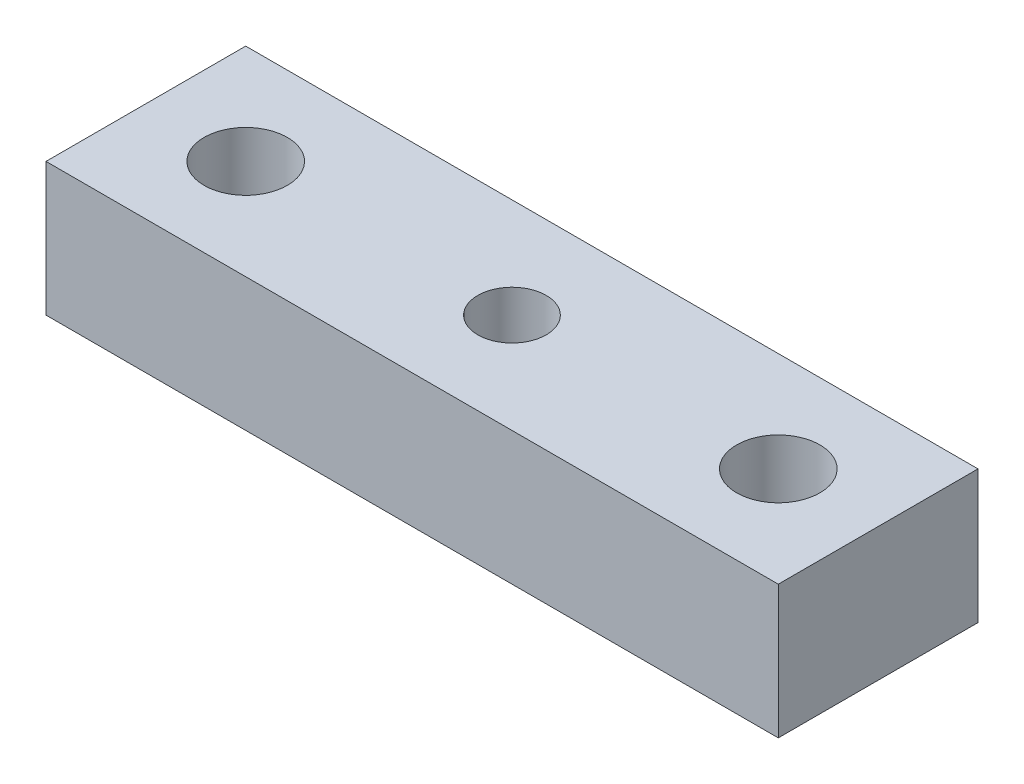
ISO-10303-21;
HEADER;
FILE_DESCRIPTION(('STEP AP214'),'2;1');
FILE_NAME('part.step','',(''),(''),'','','');
FILE_SCHEMA(('AUTOMOTIVE_DESIGN { 1 0 10303 214 1 1 1 1 }'));
ENDSEC;
DATA;
#1=APPLICATION_CONTEXT('core data for automotive mechanical design processes');
#2=APPLICATION_PROTOCOL_DEFINITION('international standard','automotive_design',2000,#1);
#3=PRODUCT_CONTEXT('',#1,'mechanical');
#4=PRODUCT('Part','Part','',(#3));
#5=PRODUCT_RELATED_PRODUCT_CATEGORY('part','',(#4));
#6=PRODUCT_DEFINITION_FORMATION('','',#4);
#7=PRODUCT_DEFINITION_CONTEXT('part definition',#1,'design');
#8=PRODUCT_DEFINITION('design','',#6,#7);
#9=PRODUCT_DEFINITION_SHAPE('','',#8);
#10=(LENGTH_UNIT() NAMED_UNIT(*) SI_UNIT(.MILLI.,.METRE.));
#11=(NAMED_UNIT(*) PLANE_ANGLE_UNIT() SI_UNIT($,.RADIAN.));
#12=(NAMED_UNIT(*) SI_UNIT($,.STERADIAN.) SOLID_ANGLE_UNIT());
#13=UNCERTAINTY_MEASURE_WITH_UNIT(LENGTH_MEASURE(1.E-05),#10,'distance_accuracy_value','');
#14=(GEOMETRIC_REPRESENTATION_CONTEXT(3) GLOBAL_UNCERTAINTY_ASSIGNED_CONTEXT((#13)) GLOBAL_UNIT_ASSIGNED_CONTEXT((#10,
#11,#12)) REPRESENTATION_CONTEXT('',''));
#15=CARTESIAN_POINT('',(0.,0.,0.));
#16=DIRECTION('',(0.,0.,1.));
#17=DIRECTION('',(1.,0.,0.));
#18=AXIS2_PLACEMENT_3D('',#15,#16,#17);
#19=CARTESIAN_POINT('',(34.925,-6.35,19.05));
#20=DIRECTION('',(-1.,0.,0.));
#21=DIRECTION('',(0.,0.,1.));
#22=AXIS2_PLACEMENT_3D('',#19,#20,#21);
#23=PLANE('',#22);
#24=DIRECTION('',(0.,1.,0.));
#25=VECTOR('',#24,1.);
#26=CARTESIAN_POINT('',(34.925,-6.35,0.));
#27=LINE('',#26,#25);
#28=CARTESIAN_POINT('',(34.925,-6.35,0.));
#29=VERTEX_POINT('',#28);
#30=CARTESIAN_POINT('',(34.925,6.35,0.));
#31=VERTEX_POINT('',#30);
#32=EDGE_CURVE('E100',#29,#31,#27,.T.);
#33=ORIENTED_EDGE('',*,*,#32,.T.);
#34=DIRECTION('',(0.,0.,-1.));
#35=VECTOR('',#34,1.);
#36=CARTESIAN_POINT('',(34.925,6.35,19.05));
#37=LINE('',#36,#35);
#38=CARTESIAN_POINT('',(34.925,6.35,19.05));
#39=VERTEX_POINT('',#38);
#40=EDGE_CURVE('E11',#39,#31,#37,.T.);
#41=ORIENTED_EDGE('',*,*,#40,.F.);
#42=DIRECTION('',(0.,1.,0.));
#43=VECTOR('',#42,1.);
#44=CARTESIAN_POINT('',(34.925,-6.35,19.05));
#45=LINE('',#44,#43);
#46=CARTESIAN_POINT('',(34.925,-6.35,19.05));
#47=VERTEX_POINT('',#46);
#48=EDGE_CURVE('E88',#47,#39,#45,.T.);
#49=ORIENTED_EDGE('',*,*,#48,.F.);
#50=DIRECTION('',(0.,0.,-1.));
#51=VECTOR('',#50,1.);
#52=CARTESIAN_POINT('',(34.925,-6.35,19.05));
#53=LINE('',#52,#51);
#54=EDGE_CURVE('E96',#47,#29,#53,.T.);
#55=ORIENTED_EDGE('',*,*,#54,.T.);
#56=EDGE_LOOP('',(#33,#41,#49,#55));
#57=FACE_BOUND('',#56,.T.);
#58=ADVANCED_FACE('F37',(#57),#23,.F.);
#59=CARTESIAN_POINT('',(-34.925,6.35,19.05));
#60=DIRECTION('',(0.,-1.,0.));
#61=DIRECTION('',(0.,0.,-1.));
#62=AXIS2_PLACEMENT_3D('',#59,#60,#61);
#63=PLANE('',#62);
#64=CARTESIAN_POINT('',(0.,6.35,9.525));
#65=DIRECTION('',(0.,1.,0.));
#66=DIRECTION('',(0.,0.,1.));
#67=AXIS2_PLACEMENT_3D('',#64,#65,#66);
#68=CIRCLE('',#67,3.26389999999999);
#69=CARTESIAN_POINT('',(0.,6.35,12.7889));
#70=VERTEX_POINT('',#69);
#71=EDGE_CURVE('E128',#70,#70,#68,.T.);
#72=ORIENTED_EDGE('',*,*,#71,.F.);
#73=EDGE_LOOP('',(#72));
#74=FACE_BOUND('',#73,.T.);
#75=CARTESIAN_POINT('',(-25.4,6.35,9.525));
#76=DIRECTION('',(0.,1.,0.));
#77=DIRECTION('',(0.,0.,1.));
#78=AXIS2_PLACEMENT_3D('',#75,#76,#77);
#79=CIRCLE('',#78,3.96875);
#80=CARTESIAN_POINT('',(-25.4,6.35,13.49375));
#81=VERTEX_POINT('',#80);
#82=EDGE_CURVE('E122',#81,#81,#79,.T.);
#83=ORIENTED_EDGE('',*,*,#82,.F.);
#84=EDGE_LOOP('',(#83));
#85=FACE_BOUND('',#84,.T.);
#86=CARTESIAN_POINT('',(25.4,6.35,9.525));
#87=DIRECTION('',(0.,1.,0.));
#88=DIRECTION('',(0.,0.,1.));
#89=AXIS2_PLACEMENT_3D('',#86,#87,#88);
#90=CIRCLE('',#89,3.96875);
#91=CARTESIAN_POINT('',(25.4,6.35,13.49375));
#92=VERTEX_POINT('',#91);
#93=EDGE_CURVE('E116',#92,#92,#90,.T.);
#94=ORIENTED_EDGE('',*,*,#93,.F.);
#95=EDGE_LOOP('',(#94));
#96=FACE_BOUND('',#95,.T.);
#97=DIRECTION('',(-1.,0.,0.));
#98=VECTOR('',#97,1.);
#99=CARTESIAN_POINT('',(-34.925,6.35,0.));
#100=LINE('',#99,#98);
#101=CARTESIAN_POINT('',(-34.925,6.35,0.));
#102=VERTEX_POINT('',#101);
#103=EDGE_CURVE('E92',#31,#102,#100,.T.);
#104=ORIENTED_EDGE('',*,*,#103,.T.);
#105=DIRECTION('',(0.,0.,-1.));
#106=VECTOR('',#105,1.);
#107=CARTESIAN_POINT('',(-34.925,6.35,19.05));
#108=LINE('',#107,#106);
#109=CARTESIAN_POINT('',(-34.925,6.35,19.05));
#110=VERTEX_POINT('',#109);
#111=EDGE_CURVE('E45',#110,#102,#108,.T.);
#112=ORIENTED_EDGE('',*,*,#111,.F.);
#113=DIRECTION('',(-1.,0.,0.));
#114=VECTOR('',#113,1.);
#115=CARTESIAN_POINT('',(-34.925,6.35,19.05));
#116=LINE('',#115,#114);
#117=EDGE_CURVE('E83',#39,#110,#116,.T.);
#118=ORIENTED_EDGE('',*,*,#117,.F.);
#119=ORIENTED_EDGE('',*,*,#40,.T.);
#120=EDGE_LOOP('',(#104,#112,#118,#119));
#121=FACE_BOUND('',#120,.T.);
#122=ADVANCED_FACE('F91',(#74,#85,#96,#121),#63,.F.);
#123=CARTESIAN_POINT('',(-34.925,-6.35,19.05));
#124=DIRECTION('',(1.,0.,0.));
#125=DIRECTION('',(0.,0.,-1.));
#126=AXIS2_PLACEMENT_3D('',#123,#124,#125);
#127=PLANE('',#126);
#128=DIRECTION('',(0.,-1.,0.));
#129=VECTOR('',#128,1.);
#130=CARTESIAN_POINT('',(-34.925,-6.35,0.));
#131=LINE('',#130,#129);
#132=CARTESIAN_POINT('',(-34.925,-6.35,0.));
#133=VERTEX_POINT('',#132);
#134=EDGE_CURVE('E70',#102,#133,#131,.T.);
#135=ORIENTED_EDGE('',*,*,#134,.T.);
#136=DIRECTION('',(0.,0.,-1.));
#137=VECTOR('',#136,1.);
#138=CARTESIAN_POINT('',(-34.925,-6.35,19.05));
#139=LINE('',#138,#137);
#140=CARTESIAN_POINT('',(-34.925,-6.35,19.05));
#141=VERTEX_POINT('',#140);
#142=EDGE_CURVE('E93',#141,#133,#139,.T.);
#143=ORIENTED_EDGE('',*,*,#142,.F.);
#144=DIRECTION('',(0.,-1.,0.));
#145=VECTOR('',#144,1.);
#146=CARTESIAN_POINT('',(-34.925,-6.35,19.05));
#147=LINE('',#146,#145);
#148=EDGE_CURVE('E86',#110,#141,#147,.T.);
#149=ORIENTED_EDGE('',*,*,#148,.F.);
#150=ORIENTED_EDGE('',*,*,#111,.T.);
#151=EDGE_LOOP('',(#135,#143,#149,#150));
#152=FACE_BOUND('',#151,.T.);
#153=ADVANCED_FACE('F94',(#152),#127,.F.);
#154=CARTESIAN_POINT('',(-34.925,-6.35,19.05));
#155=DIRECTION('',(0.,1.,0.));
#156=DIRECTION('',(0.,0.,1.));
#157=AXIS2_PLACEMENT_3D('',#154,#155,#156);
#158=PLANE('',#157);
#159=CARTESIAN_POINT('',(0.,-6.35,9.525));
#160=DIRECTION('',(0.,1.,0.));
#161=DIRECTION('',(0.,0.,1.));
#162=AXIS2_PLACEMENT_3D('',#159,#160,#161);
#163=CIRCLE('',#162,3.2639);
#164=CARTESIAN_POINT('',(0.,-6.35,12.7889));
#165=VERTEX_POINT('',#164);
#166=EDGE_CURVE('E125',#165,#165,#163,.T.);
#167=ORIENTED_EDGE('',*,*,#166,.T.);
#168=EDGE_LOOP('',(#167));
#169=FACE_BOUND('',#168,.T.);
#170=CARTESIAN_POINT('',(-25.4,-6.35,9.525));
#171=DIRECTION('',(0.,1.,0.));
#172=DIRECTION('',(0.,0.,1.));
#173=AXIS2_PLACEMENT_3D('',#170,#171,#172);
#174=CIRCLE('',#173,3.96875);
#175=CARTESIAN_POINT('',(-25.4,-6.35,13.49375));
#176=VERTEX_POINT('',#175);
#177=EDGE_CURVE('E119',#176,#176,#174,.T.);
#178=ORIENTED_EDGE('',*,*,#177,.T.);
#179=EDGE_LOOP('',(#178));
#180=FACE_BOUND('',#179,.T.);
#181=CARTESIAN_POINT('',(25.4,-6.35,9.525));
#182=DIRECTION('',(0.,1.,0.));
#183=DIRECTION('',(0.,0.,1.));
#184=AXIS2_PLACEMENT_3D('',#181,#182,#183);
#185=CIRCLE('',#184,3.96875);
#186=CARTESIAN_POINT('',(25.4,-6.35,13.49375));
#187=VERTEX_POINT('',#186);
#188=EDGE_CURVE('E103',#187,#187,#185,.T.);
#189=ORIENTED_EDGE('',*,*,#188,.T.);
#190=EDGE_LOOP('',(#189));
#191=FACE_BOUND('',#190,.T.);
#192=DIRECTION('',(1.,0.,0.));
#193=VECTOR('',#192,1.);
#194=CARTESIAN_POINT('',(-34.925,-6.35,0.));
#195=LINE('',#194,#193);
#196=EDGE_CURVE('E76',#133,#29,#195,.T.);
#197=ORIENTED_EDGE('',*,*,#196,.T.);
#198=ORIENTED_EDGE('',*,*,#54,.F.);
#199=DIRECTION('',(1.,0.,0.));
#200=VECTOR('',#199,1.);
#201=CARTESIAN_POINT('',(-34.925,-6.35,19.05));
#202=LINE('',#201,#200);
#203=EDGE_CURVE('E53',#141,#47,#202,.T.);
#204=ORIENTED_EDGE('',*,*,#203,.F.);
#205=ORIENTED_EDGE('',*,*,#142,.T.);
#206=EDGE_LOOP('',(#197,#198,#204,#205));
#207=FACE_BOUND('',#206,.T.);
#208=ADVANCED_FACE('F108',(#169,#180,#191,#207),#158,.F.);
#209=CARTESIAN_POINT('',(0.,0.,19.05));
#210=DIRECTION('',(0.,0.,-1.));
#211=DIRECTION('',(-1.,0.,0.));
#212=AXIS2_PLACEMENT_3D('',#209,#210,#211);
#213=PLANE('',#212);
#214=ORIENTED_EDGE('',*,*,#48,.T.);
#215=ORIENTED_EDGE('',*,*,#117,.T.);
#216=ORIENTED_EDGE('',*,*,#148,.T.);
#217=ORIENTED_EDGE('',*,*,#203,.T.);
#218=EDGE_LOOP('',(#214,#215,#216,#217));
#219=FACE_BOUND('',#218,.T.);
#220=ADVANCED_FACE('F84',(#219),#213,.F.);
#221=CARTESIAN_POINT('',(0.,0.,0.));
#222=DIRECTION('',(0.,0.,-1.));
#223=DIRECTION('',(-1.,0.,0.));
#224=AXIS2_PLACEMENT_3D('',#221,#222,#223);
#225=PLANE('',#224);
#226=ORIENTED_EDGE('',*,*,#32,.F.);
#227=ORIENTED_EDGE('',*,*,#196,.F.);
#228=ORIENTED_EDGE('',*,*,#134,.F.);
#229=ORIENTED_EDGE('',*,*,#103,.F.);
#230=EDGE_LOOP('',(#226,#227,#228,#229));
#231=FACE_BOUND('',#230,.T.);
#232=ADVANCED_FACE('F111',(#231),#225,.T.);
#233=CARTESIAN_POINT('',(25.4,6.35,9.525));
#234=DIRECTION('',(0.,1.,0.));
#235=DIRECTION('',(0.,0.,1.));
#236=AXIS2_PLACEMENT_3D('',#233,#234,#235);
#237=CYLINDRICAL_SURFACE('',#236,3.96875);
#238=ORIENTED_EDGE('',*,*,#188,.F.);
#239=EDGE_LOOP('',(#238));
#240=FACE_BOUND('',#239,.T.);
#241=ORIENTED_EDGE('',*,*,#93,.T.);
#242=EDGE_LOOP('',(#241));
#243=FACE_BOUND('',#242,.T.);
#244=ADVANCED_FACE('F140',(#240,#243),#237,.F.);
#245=CARTESIAN_POINT('',(-25.4,6.35,9.525));
#246=DIRECTION('',(0.,1.,0.));
#247=DIRECTION('',(0.,0.,1.));
#248=AXIS2_PLACEMENT_3D('',#245,#246,#247);
#249=CYLINDRICAL_SURFACE('',#248,3.96875);
#250=ORIENTED_EDGE('',*,*,#177,.F.);
#251=EDGE_LOOP('',(#250));
#252=FACE_BOUND('',#251,.T.);
#253=ORIENTED_EDGE('',*,*,#82,.T.);
#254=EDGE_LOOP('',(#253));
#255=FACE_BOUND('',#254,.T.);
#256=ADVANCED_FACE('F142',(#252,#255),#249,.F.);
#257=CARTESIAN_POINT('',(0.,6.35,9.525));
#258=DIRECTION('',(0.,1.,0.));
#259=DIRECTION('',(0.,0.,1.));
#260=AXIS2_PLACEMENT_3D('',#257,#258,#259);
#261=CYLINDRICAL_SURFACE('',#260,3.26389999999999);
#262=ORIENTED_EDGE('',*,*,#166,.F.);
#263=EDGE_LOOP('',(#262));
#264=FACE_BOUND('',#263,.T.);
#265=ORIENTED_EDGE('',*,*,#71,.T.);
#266=EDGE_LOOP('',(#265));
#267=FACE_BOUND('',#266,.T.);
#268=ADVANCED_FACE('F132',(#264,#267),#261,.F.);
#269=CLOSED_SHELL('',(#58,#122,#153,#208,#220,#232,#244,#256,#268));
#270=MANIFOLD_SOLID_BREP('B2',#269);
#271=ADVANCED_BREP_SHAPE_REPRESENTATION('',(#18,#270),#14);
#272=SHAPE_DEFINITION_REPRESENTATION(#9,#271);
ENDSEC;
END-ISO-10303-21;
